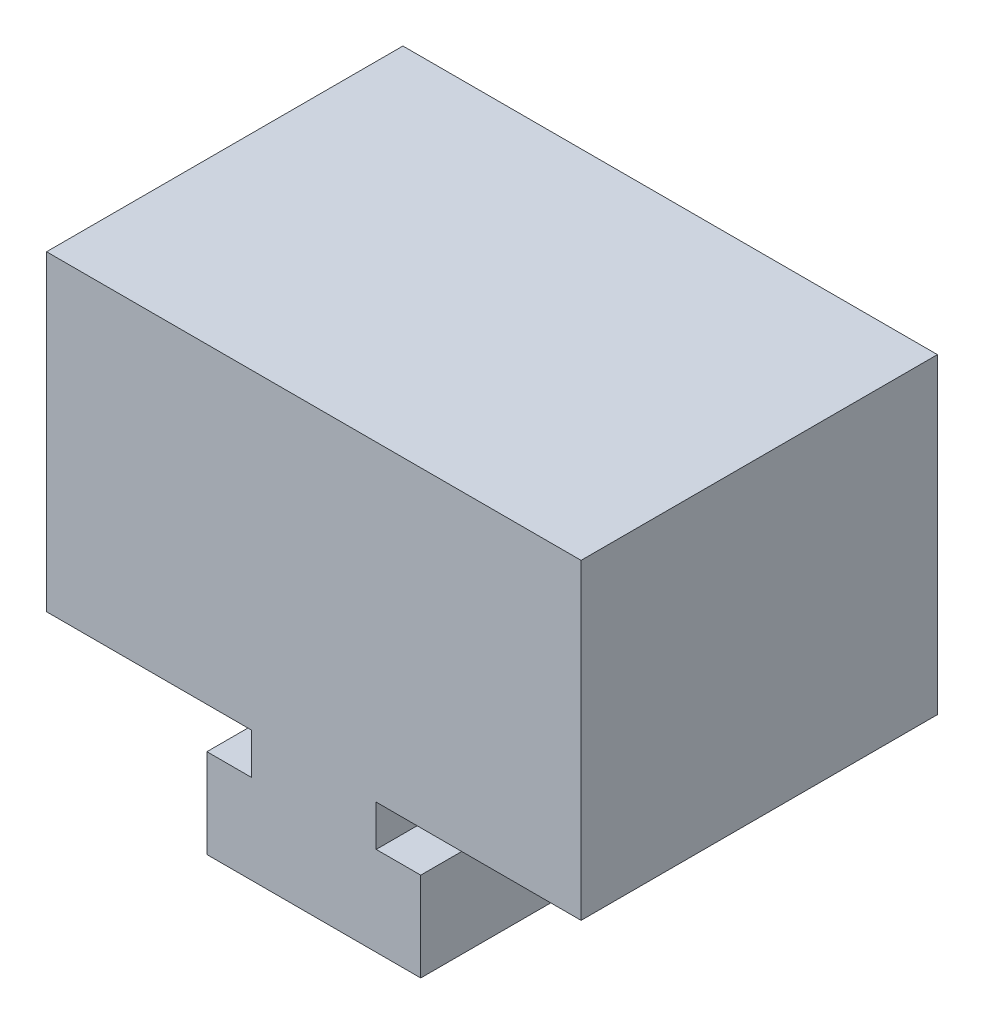
ISO-10303-21;
HEADER;
FILE_DESCRIPTION(('STEP AP214'),'2;1');
FILE_NAME('part.step','',(''),(''),'','','');
FILE_SCHEMA(('AUTOMOTIVE_DESIGN { 1 0 10303 214 1 1 1 1 }'));
ENDSEC;
DATA;
#1=APPLICATION_CONTEXT('core data for automotive mechanical design processes');
#2=APPLICATION_PROTOCOL_DEFINITION('international standard','automotive_design',2000,#1);
#3=PRODUCT_CONTEXT('',#1,'mechanical');
#4=PRODUCT('Part','Part','',(#3));
#5=PRODUCT_RELATED_PRODUCT_CATEGORY('part','',(#4));
#6=PRODUCT_DEFINITION_FORMATION('','',#4);
#7=PRODUCT_DEFINITION_CONTEXT('part definition',#1,'design');
#8=PRODUCT_DEFINITION('design','',#6,#7);
#9=PRODUCT_DEFINITION_SHAPE('','',#8);
#10=(LENGTH_UNIT() NAMED_UNIT(*) SI_UNIT(.MILLI.,.METRE.));
#11=(NAMED_UNIT(*) PLANE_ANGLE_UNIT() SI_UNIT($,.RADIAN.));
#12=(NAMED_UNIT(*) SI_UNIT($,.STERADIAN.) SOLID_ANGLE_UNIT());
#13=UNCERTAINTY_MEASURE_WITH_UNIT(LENGTH_MEASURE(1.E-05),#10,'distance_accuracy_value','');
#14=(GEOMETRIC_REPRESENTATION_CONTEXT(3) GLOBAL_UNCERTAINTY_ASSIGNED_CONTEXT((#13)) GLOBAL_UNIT_ASSIGNED_CONTEXT((#10,
#11,#12)) REPRESENTATION_CONTEXT('',''));
#15=CARTESIAN_POINT('',(0.,0.,0.));
#16=DIRECTION('',(0.,0.,1.));
#17=DIRECTION('',(1.,0.,0.));
#18=AXIS2_PLACEMENT_3D('',#15,#16,#17);
#19=CARTESIAN_POINT('',(15.,-8.75,20.));
#20=DIRECTION('',(-1.,0.,0.));
#21=DIRECTION('',(0.,0.,1.));
#22=AXIS2_PLACEMENT_3D('',#19,#20,#21);
#23=PLANE('',#22);
#24=DIRECTION('',(0.,1.,0.));
#25=VECTOR('',#24,1.);
#26=CARTESIAN_POINT('',(15.,-8.75,0.));
#27=LINE('',#26,#25);
#28=CARTESIAN_POINT('',(15.,-8.75,0.));
#29=VERTEX_POINT('',#28);
#30=CARTESIAN_POINT('',(15.,8.75,0.));
#31=VERTEX_POINT('',#30);
#32=EDGE_CURVE('E161',#29,#31,#27,.T.);
#33=ORIENTED_EDGE('',*,*,#32,.T.);
#34=DIRECTION('',(0.,0.,-1.));
#35=VECTOR('',#34,1.);
#36=CARTESIAN_POINT('',(15.,8.75,20.));
#37=LINE('',#36,#35);
#38=CARTESIAN_POINT('',(15.,8.75,20.));
#39=VERTEX_POINT('',#38);
#40=EDGE_CURVE('E11',#39,#31,#37,.T.);
#41=ORIENTED_EDGE('',*,*,#40,.F.);
#42=DIRECTION('',(0.,1.,0.));
#43=VECTOR('',#42,1.);
#44=CARTESIAN_POINT('',(15.,-8.75,20.));
#45=LINE('',#44,#43);
#46=CARTESIAN_POINT('',(15.,-8.75,20.));
#47=VERTEX_POINT('',#46);
#48=EDGE_CURVE('E183',#47,#39,#45,.T.);
#49=ORIENTED_EDGE('',*,*,#48,.F.);
#50=DIRECTION('',(0.,0.,-1.));
#51=VECTOR('',#50,1.);
#52=CARTESIAN_POINT('',(15.,-8.75,20.));
#53=LINE('',#52,#51);
#54=EDGE_CURVE('E157',#47,#29,#53,.T.);
#55=ORIENTED_EDGE('',*,*,#54,.T.);
#56=EDGE_LOOP('',(#33,#41,#49,#55));
#57=FACE_BOUND('',#56,.T.);
#58=ADVANCED_FACE('F41',(#57),#23,.F.);
#59=CARTESIAN_POINT('',(-15.,8.75,20.));
#60=DIRECTION('',(0.,-1.,0.));
#61=DIRECTION('',(0.,0.,-1.));
#62=AXIS2_PLACEMENT_3D('',#59,#60,#61);
#63=PLANE('',#62);
#64=DIRECTION('',(-1.,0.,0.));
#65=VECTOR('',#64,1.);
#66=CARTESIAN_POINT('',(-15.,8.75,0.));
#67=LINE('',#66,#65);
#68=CARTESIAN_POINT('',(-15.,8.75,0.));
#69=VERTEX_POINT('',#68);
#70=EDGE_CURVE('E164',#31,#69,#67,.T.);
#71=ORIENTED_EDGE('',*,*,#70,.T.);
#72=DIRECTION('',(0.,0.,-1.));
#73=VECTOR('',#72,1.);
#74=CARTESIAN_POINT('',(-15.,8.75,20.));
#75=LINE('',#74,#73);
#76=CARTESIAN_POINT('',(-15.,8.75,20.));
#77=VERTEX_POINT('',#76);
#78=EDGE_CURVE('E49',#77,#69,#75,.T.);
#79=ORIENTED_EDGE('',*,*,#78,.F.);
#80=DIRECTION('',(-1.,0.,0.));
#81=VECTOR('',#80,1.);
#82=CARTESIAN_POINT('',(-15.,8.75,20.));
#83=LINE('',#82,#81);
#84=EDGE_CURVE('E112',#39,#77,#83,.T.);
#85=ORIENTED_EDGE('',*,*,#84,.F.);
#86=ORIENTED_EDGE('',*,*,#40,.T.);
#87=EDGE_LOOP('',(#71,#79,#85,#86));
#88=FACE_BOUND('',#87,.T.);
#89=ADVANCED_FACE('F261',(#88),#63,.F.);
#90=CARTESIAN_POINT('',(-15.,-8.75,20.));
#91=DIRECTION('',(1.,0.,0.));
#92=DIRECTION('',(0.,0.,-1.));
#93=AXIS2_PLACEMENT_3D('',#90,#91,#92);
#94=PLANE('',#93);
#95=DIRECTION('',(0.,-1.,0.));
#96=VECTOR('',#95,1.);
#97=CARTESIAN_POINT('',(-15.,-8.75,0.));
#98=LINE('',#97,#96);
#99=CARTESIAN_POINT('',(-15.,-8.75,0.));
#100=VERTEX_POINT('',#99);
#101=EDGE_CURVE('E166',#69,#100,#98,.T.);
#102=ORIENTED_EDGE('',*,*,#101,.T.);
#103=DIRECTION('',(0.,0.,-1.));
#104=VECTOR('',#103,1.);
#105=CARTESIAN_POINT('',(-15.,-8.75,20.));
#106=LINE('',#105,#104);
#107=CARTESIAN_POINT('',(-15.,-8.75,20.));
#108=VERTEX_POINT('',#107);
#109=EDGE_CURVE('E202',#108,#100,#106,.T.);
#110=ORIENTED_EDGE('',*,*,#109,.F.);
#111=DIRECTION('',(0.,-1.,0.));
#112=VECTOR('',#111,1.);
#113=CARTESIAN_POINT('',(-15.,-8.75,20.));
#114=LINE('',#113,#112);
#115=EDGE_CURVE('E210',#77,#108,#114,.T.);
#116=ORIENTED_EDGE('',*,*,#115,.F.);
#117=ORIENTED_EDGE('',*,*,#78,.T.);
#118=EDGE_LOOP('',(#102,#110,#116,#117));
#119=FACE_BOUND('',#118,.T.);
#120=ADVANCED_FACE('F208',(#119),#94,.F.);
#121=CARTESIAN_POINT('',(-3.50000000000001,-8.75,20.));
#122=DIRECTION('',(0.,1.,0.));
#123=DIRECTION('',(-1.,0.,0.));
#124=AXIS2_PLACEMENT_3D('',#121,#122,#123);
#125=PLANE('',#124);
#126=DIRECTION('',(1.,0.,0.));
#127=VECTOR('',#126,1.);
#128=CARTESIAN_POINT('',(-3.50000000000001,-8.75,0.));
#129=LINE('',#128,#127);
#130=CARTESIAN_POINT('',(-3.50000000000001,-8.75,0.));
#131=VERTEX_POINT('',#130);
#132=EDGE_CURVE('E168',#100,#131,#129,.T.);
#133=ORIENTED_EDGE('',*,*,#132,.T.);
#134=DIRECTION('',(0.,0.,-1.));
#135=VECTOR('',#134,1.);
#136=CARTESIAN_POINT('',(-3.50000000000001,-8.75,20.));
#137=LINE('',#136,#135);
#138=CARTESIAN_POINT('',(-3.50000000000001,-8.75,20.));
#139=VERTEX_POINT('',#138);
#140=EDGE_CURVE('E199',#139,#131,#137,.T.);
#141=ORIENTED_EDGE('',*,*,#140,.F.);
#142=DIRECTION('',(1.,0.,0.));
#143=VECTOR('',#142,1.);
#144=CARTESIAN_POINT('',(-3.50000000000001,-8.75,20.));
#145=LINE('',#144,#143);
#146=EDGE_CURVE('E228',#108,#139,#145,.T.);
#147=ORIENTED_EDGE('',*,*,#146,.F.);
#148=ORIENTED_EDGE('',*,*,#109,.T.);
#149=EDGE_LOOP('',(#133,#141,#147,#148));
#150=FACE_BOUND('',#149,.T.);
#151=ADVANCED_FACE('F219',(#150),#125,.F.);
#152=CARTESIAN_POINT('',(-3.50000000000001,-11.05,20.));
#153=DIRECTION('',(1.,0.,0.));
#154=DIRECTION('',(0.,1.,0.));
#155=AXIS2_PLACEMENT_3D('',#152,#153,#154);
#156=PLANE('',#155);
#157=DIRECTION('',(0.,-1.,0.));
#158=VECTOR('',#157,1.);
#159=CARTESIAN_POINT('',(-3.50000000000001,-11.05,0.));
#160=LINE('',#159,#158);
#161=CARTESIAN_POINT('',(-3.50000000000001,-11.05,0.));
#162=VERTEX_POINT('',#161);
#163=EDGE_CURVE('E170',#131,#162,#160,.T.);
#164=ORIENTED_EDGE('',*,*,#163,.T.);
#165=DIRECTION('',(0.,0.,-1.));
#166=VECTOR('',#165,1.);
#167=CARTESIAN_POINT('',(-3.50000000000001,-11.05,20.));
#168=LINE('',#167,#166);
#169=CARTESIAN_POINT('',(-3.50000000000001,-11.05,20.));
#170=VERTEX_POINT('',#169);
#171=EDGE_CURVE('E196',#170,#162,#168,.T.);
#172=ORIENTED_EDGE('',*,*,#171,.F.);
#173=DIRECTION('',(0.,-1.,0.));
#174=VECTOR('',#173,1.);
#175=CARTESIAN_POINT('',(-3.50000000000001,-11.05,20.));
#176=LINE('',#175,#174);
#177=EDGE_CURVE('E225',#139,#170,#176,.T.);
#178=ORIENTED_EDGE('',*,*,#177,.F.);
#179=ORIENTED_EDGE('',*,*,#140,.T.);
#180=EDGE_LOOP('',(#164,#172,#178,#179));
#181=FACE_BOUND('',#180,.T.);
#182=ADVANCED_FACE('F223',(#181),#156,.F.);
#183=CARTESIAN_POINT('',(-6.00000000000001,-11.05,20.));
#184=DIRECTION('',(0.,-1.,0.));
#185=DIRECTION('',(0.,0.,-1.));
#186=AXIS2_PLACEMENT_3D('',#183,#184,#185);
#187=PLANE('',#186);
#188=DIRECTION('',(-1.,0.,0.));
#189=VECTOR('',#188,1.);
#190=CARTESIAN_POINT('',(-6.00000000000001,-11.05,0.));
#191=LINE('',#190,#189);
#192=CARTESIAN_POINT('',(-6.00000000000001,-11.05,0.));
#193=VERTEX_POINT('',#192);
#194=EDGE_CURVE('E172',#162,#193,#191,.T.);
#195=ORIENTED_EDGE('',*,*,#194,.T.);
#196=DIRECTION('',(0.,0.,-1.));
#197=VECTOR('',#196,1.);
#198=CARTESIAN_POINT('',(-6.00000000000001,-11.05,20.));
#199=LINE('',#198,#197);
#200=CARTESIAN_POINT('',(-6.00000000000001,-11.05,20.));
#201=VERTEX_POINT('',#200);
#202=EDGE_CURVE('E193',#201,#193,#199,.T.);
#203=ORIENTED_EDGE('',*,*,#202,.F.);
#204=DIRECTION('',(-1.,0.,0.));
#205=VECTOR('',#204,1.);
#206=CARTESIAN_POINT('',(-6.00000000000001,-11.05,20.));
#207=LINE('',#206,#205);
#208=EDGE_CURVE('E227',#170,#201,#207,.T.);
#209=ORIENTED_EDGE('',*,*,#208,.F.);
#210=ORIENTED_EDGE('',*,*,#171,.T.);
#211=EDGE_LOOP('',(#195,#203,#209,#210));
#212=FACE_BOUND('',#211,.T.);
#213=ADVANCED_FACE('F274',(#212),#187,.F.);
#214=CARTESIAN_POINT('',(-6.00000000000001,-16.05,20.));
#215=DIRECTION('',(1.,0.,0.));
#216=DIRECTION('',(0.,0.,-1.));
#217=AXIS2_PLACEMENT_3D('',#214,#215,#216);
#218=PLANE('',#217);
#219=DIRECTION('',(0.,-1.,0.));
#220=VECTOR('',#219,1.);
#221=CARTESIAN_POINT('',(-6.00000000000001,-16.05,0.));
#222=LINE('',#221,#220);
#223=CARTESIAN_POINT('',(-6.00000000000001,-16.05,0.));
#224=VERTEX_POINT('',#223);
#225=EDGE_CURVE('E174',#193,#224,#222,.T.);
#226=ORIENTED_EDGE('',*,*,#225,.T.);
#227=DIRECTION('',(0.,0.,-1.));
#228=VECTOR('',#227,1.);
#229=CARTESIAN_POINT('',(-6.00000000000001,-16.05,20.));
#230=LINE('',#229,#228);
#231=CARTESIAN_POINT('',(-6.00000000000001,-16.05,20.));
#232=VERTEX_POINT('',#231);
#233=EDGE_CURVE('E190',#232,#224,#230,.T.);
#234=ORIENTED_EDGE('',*,*,#233,.F.);
#235=DIRECTION('',(0.,-1.,0.));
#236=VECTOR('',#235,1.);
#237=CARTESIAN_POINT('',(-6.00000000000001,-16.05,20.));
#238=LINE('',#237,#236);
#239=EDGE_CURVE('E230',#201,#232,#238,.T.);
#240=ORIENTED_EDGE('',*,*,#239,.F.);
#241=ORIENTED_EDGE('',*,*,#202,.T.);
#242=EDGE_LOOP('',(#226,#234,#240,#241));
#243=FACE_BOUND('',#242,.T.);
#244=ADVANCED_FACE('F277',(#243),#218,.F.);
#245=CARTESIAN_POINT('',(-6.00000000000001,-16.05,20.));
#246=DIRECTION('',(0.,1.,0.));
#247=DIRECTION('',(0.,0.,1.));
#248=AXIS2_PLACEMENT_3D('',#245,#246,#247);
#249=PLANE('',#248);
#250=DIRECTION('',(1.,0.,0.));
#251=VECTOR('',#250,1.);
#252=CARTESIAN_POINT('',(-6.00000000000001,-16.05,0.));
#253=LINE('',#252,#251);
#254=CARTESIAN_POINT('',(5.99999999999999,-16.05,0.));
#255=VERTEX_POINT('',#254);
#256=EDGE_CURVE('E176',#224,#255,#253,.T.);
#257=ORIENTED_EDGE('',*,*,#256,.T.);
#258=DIRECTION('',(0.,0.,-1.));
#259=VECTOR('',#258,1.);
#260=CARTESIAN_POINT('',(5.99999999999999,-16.05,20.));
#261=LINE('',#260,#259);
#262=CARTESIAN_POINT('',(5.99999999999999,-16.05,20.));
#263=VERTEX_POINT('',#262);
#264=EDGE_CURVE('E187',#263,#255,#261,.T.);
#265=ORIENTED_EDGE('',*,*,#264,.F.);
#266=DIRECTION('',(1.,0.,0.));
#267=VECTOR('',#266,1.);
#268=CARTESIAN_POINT('',(-6.00000000000001,-16.05,20.));
#269=LINE('',#268,#267);
#270=EDGE_CURVE('E236',#232,#263,#269,.T.);
#271=ORIENTED_EDGE('',*,*,#270,.F.);
#272=ORIENTED_EDGE('',*,*,#233,.T.);
#273=EDGE_LOOP('',(#257,#265,#271,#272));
#274=FACE_BOUND('',#273,.T.);
#275=ADVANCED_FACE('F242',(#274),#249,.F.);
#276=CARTESIAN_POINT('',(5.99999999999999,-16.05,20.));
#277=DIRECTION('',(-1.,0.,0.));
#278=DIRECTION('',(0.,0.,1.));
#279=AXIS2_PLACEMENT_3D('',#276,#277,#278);
#280=PLANE('',#279);
#281=DIRECTION('',(0.,1.,0.));
#282=VECTOR('',#281,1.);
#283=CARTESIAN_POINT('',(5.99999999999999,-16.05,0.));
#284=LINE('',#283,#282);
#285=CARTESIAN_POINT('',(5.99999999999999,-11.05,0.));
#286=VERTEX_POINT('',#285);
#287=EDGE_CURVE('E178',#255,#286,#284,.T.);
#288=ORIENTED_EDGE('',*,*,#287,.T.);
#289=DIRECTION('',(0.,0.,-1.));
#290=VECTOR('',#289,1.);
#291=CARTESIAN_POINT('',(5.99999999999999,-11.05,20.));
#292=LINE('',#291,#290);
#293=CARTESIAN_POINT('',(5.99999999999999,-11.05,20.));
#294=VERTEX_POINT('',#293);
#295=EDGE_CURVE('E152',#294,#286,#292,.T.);
#296=ORIENTED_EDGE('',*,*,#295,.F.);
#297=DIRECTION('',(0.,1.,0.));
#298=VECTOR('',#297,1.);
#299=CARTESIAN_POINT('',(5.99999999999999,-16.05,20.));
#300=LINE('',#299,#298);
#301=EDGE_CURVE('E143',#263,#294,#300,.T.);
#302=ORIENTED_EDGE('',*,*,#301,.F.);
#303=ORIENTED_EDGE('',*,*,#264,.T.);
#304=EDGE_LOOP('',(#288,#296,#302,#303));
#305=FACE_BOUND('',#304,.T.);
#306=ADVANCED_FACE('F246',(#305),#280,.F.);
#307=CARTESIAN_POINT('',(5.99999999999999,-11.05,20.));
#308=DIRECTION('',(0.,-1.,0.));
#309=DIRECTION('',(0.,0.,-1.));
#310=AXIS2_PLACEMENT_3D('',#307,#308,#309);
#311=PLANE('',#310);
#312=DIRECTION('',(-1.,0.,0.));
#313=VECTOR('',#312,1.);
#314=CARTESIAN_POINT('',(5.99999999999999,-11.05,0.));
#315=LINE('',#314,#313);
#316=CARTESIAN_POINT('',(3.49999999999999,-11.05,0.));
#317=VERTEX_POINT('',#316);
#318=EDGE_CURVE('E151',#286,#317,#315,.T.);
#319=ORIENTED_EDGE('',*,*,#318,.T.);
#320=DIRECTION('',(0.,0.,-1.));
#321=VECTOR('',#320,1.);
#322=CARTESIAN_POINT('',(3.49999999999999,-11.05,20.));
#323=LINE('',#322,#321);
#324=CARTESIAN_POINT('',(3.49999999999999,-11.05,20.));
#325=VERTEX_POINT('',#324);
#326=EDGE_CURVE('E148',#325,#317,#323,.T.);
#327=ORIENTED_EDGE('',*,*,#326,.F.);
#328=DIRECTION('',(-1.,0.,0.));
#329=VECTOR('',#328,1.);
#330=CARTESIAN_POINT('',(5.99999999999999,-11.05,20.));
#331=LINE('',#330,#329);
#332=EDGE_CURVE('E137',#294,#325,#331,.T.);
#333=ORIENTED_EDGE('',*,*,#332,.F.);
#334=ORIENTED_EDGE('',*,*,#295,.T.);
#335=EDGE_LOOP('',(#319,#327,#333,#334));
#336=FACE_BOUND('',#335,.T.);
#337=ADVANCED_FACE('F149',(#336),#311,.F.);
#338=CARTESIAN_POINT('',(3.49999999999999,-11.05,20.));
#339=DIRECTION('',(-1.,0.,0.));
#340=DIRECTION('',(0.,0.,1.));
#341=AXIS2_PLACEMENT_3D('',#338,#339,#340);
#342=PLANE('',#341);
#343=DIRECTION('',(0.,1.,0.));
#344=VECTOR('',#343,1.);
#345=CARTESIAN_POINT('',(3.49999999999999,-11.05,0.));
#346=LINE('',#345,#344);
#347=CARTESIAN_POINT('',(3.49999999999999,-8.75,0.));
#348=VERTEX_POINT('',#347);
#349=EDGE_CURVE('E98',#317,#348,#346,.T.);
#350=ORIENTED_EDGE('',*,*,#349,.T.);
#351=DIRECTION('',(0.,0.,-1.));
#352=VECTOR('',#351,1.);
#353=CARTESIAN_POINT('',(3.49999999999999,-8.75,20.));
#354=LINE('',#353,#352);
#355=CARTESIAN_POINT('',(3.49999999999999,-8.75,20.));
#356=VERTEX_POINT('',#355);
#357=EDGE_CURVE('E153',#356,#348,#354,.T.);
#358=ORIENTED_EDGE('',*,*,#357,.F.);
#359=DIRECTION('',(0.,1.,0.));
#360=VECTOR('',#359,1.);
#361=CARTESIAN_POINT('',(3.49999999999999,-11.05,20.));
#362=LINE('',#361,#360);
#363=EDGE_CURVE('E141',#325,#356,#362,.T.);
#364=ORIENTED_EDGE('',*,*,#363,.F.);
#365=ORIENTED_EDGE('',*,*,#326,.T.);
#366=EDGE_LOOP('',(#350,#358,#364,#365));
#367=FACE_BOUND('',#366,.T.);
#368=ADVANCED_FACE('F155',(#367),#342,.F.);
#369=CARTESIAN_POINT('',(3.49999999999999,-8.75,20.));
#370=DIRECTION('',(0.,1.,0.));
#371=DIRECTION('',(0.,0.,1.));
#372=AXIS2_PLACEMENT_3D('',#369,#370,#371);
#373=PLANE('',#372);
#374=DIRECTION('',(1.,0.,0.));
#375=VECTOR('',#374,1.);
#376=CARTESIAN_POINT('',(3.49999999999999,-8.75,0.));
#377=LINE('',#376,#375);
#378=EDGE_CURVE('E104',#348,#29,#377,.T.);
#379=ORIENTED_EDGE('',*,*,#378,.T.);
#380=ORIENTED_EDGE('',*,*,#54,.F.);
#381=DIRECTION('',(1.,0.,0.));
#382=VECTOR('',#381,1.);
#383=CARTESIAN_POINT('',(3.49999999999999,-8.75,20.));
#384=LINE('',#383,#382);
#385=EDGE_CURVE('E57',#356,#47,#384,.T.);
#386=ORIENTED_EDGE('',*,*,#385,.F.);
#387=ORIENTED_EDGE('',*,*,#357,.T.);
#388=EDGE_LOOP('',(#379,#380,#386,#387));
#389=FACE_BOUND('',#388,.T.);
#390=ADVANCED_FACE('F250',(#389),#373,.F.);
#391=CARTESIAN_POINT('',(0.,0.,20.));
#392=DIRECTION('',(0.,0.,-1.));
#393=DIRECTION('',(-1.,0.,0.));
#394=AXIS2_PLACEMENT_3D('',#391,#392,#393);
#395=PLANE('',#394);
#396=ORIENTED_EDGE('',*,*,#48,.T.);
#397=ORIENTED_EDGE('',*,*,#84,.T.);
#398=ORIENTED_EDGE('',*,*,#115,.T.);
#399=ORIENTED_EDGE('',*,*,#146,.T.);
#400=ORIENTED_EDGE('',*,*,#177,.T.);
#401=ORIENTED_EDGE('',*,*,#208,.T.);
#402=ORIENTED_EDGE('',*,*,#239,.T.);
#403=ORIENTED_EDGE('',*,*,#270,.T.);
#404=ORIENTED_EDGE('',*,*,#301,.T.);
#405=ORIENTED_EDGE('',*,*,#332,.T.);
#406=ORIENTED_EDGE('',*,*,#363,.T.);
#407=ORIENTED_EDGE('',*,*,#385,.T.);
#408=EDGE_LOOP('',(#396,#397,#398,#399,#400,#401,#402,#403,#404,#405,#406,#407));
#409=FACE_BOUND('',#408,.T.);
#410=ADVANCED_FACE('F139',(#409),#395,.F.);
#411=CARTESIAN_POINT('',(0.,0.,0.));
#412=DIRECTION('',(0.,0.,-1.));
#413=DIRECTION('',(-1.,0.,0.));
#414=AXIS2_PLACEMENT_3D('',#411,#412,#413);
#415=PLANE('',#414);
#416=ORIENTED_EDGE('',*,*,#32,.F.);
#417=ORIENTED_EDGE('',*,*,#378,.F.);
#418=ORIENTED_EDGE('',*,*,#349,.F.);
#419=ORIENTED_EDGE('',*,*,#318,.F.);
#420=ORIENTED_EDGE('',*,*,#287,.F.);
#421=ORIENTED_EDGE('',*,*,#256,.F.);
#422=ORIENTED_EDGE('',*,*,#225,.F.);
#423=ORIENTED_EDGE('',*,*,#194,.F.);
#424=ORIENTED_EDGE('',*,*,#163,.F.);
#425=ORIENTED_EDGE('',*,*,#132,.F.);
#426=ORIENTED_EDGE('',*,*,#101,.F.);
#427=ORIENTED_EDGE('',*,*,#70,.F.);
#428=EDGE_LOOP('',(#416,#417,#418,#419,#420,#421,#422,#423,#424,#425,#426,#427));
#429=FACE_BOUND('',#428,.T.);
#430=ADVANCED_FACE('F214',(#429),#415,.T.);
#431=CLOSED_SHELL('',(#58,#89,#120,#151,#182,#213,#244,#275,#306,#337,#368,#390,#410,#430));
#432=MANIFOLD_SOLID_BREP('B2',#431);
#433=ADVANCED_BREP_SHAPE_REPRESENTATION('',(#18,#432),#14);
#434=SHAPE_DEFINITION_REPRESENTATION(#9,#433);
ENDSEC;
END-ISO-10303-21;
